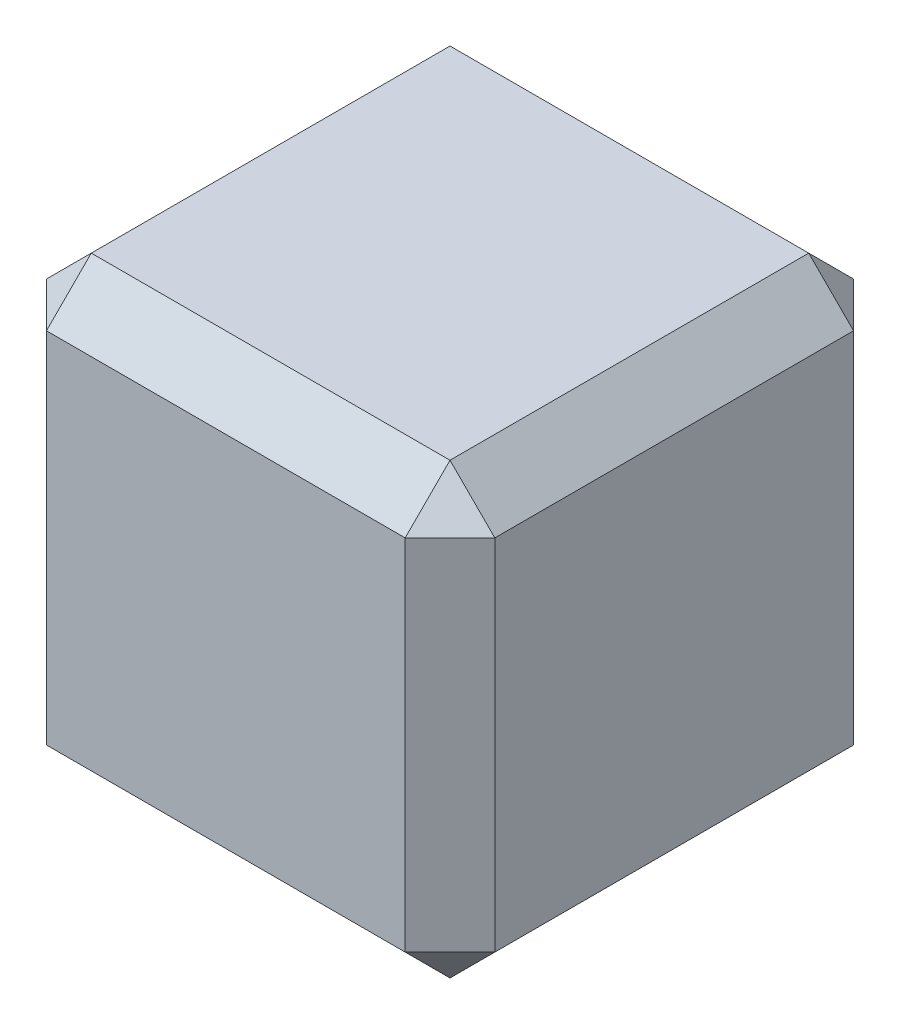
ISO-10303-21;
HEADER;
FILE_DESCRIPTION(('STEP AP214'),'2;1');
FILE_NAME('part.step','',(''),(''),'','','');
FILE_SCHEMA(('AUTOMOTIVE_DESIGN { 1 0 10303 214 1 1 1 1 }'));
ENDSEC;
DATA;
#1=APPLICATION_CONTEXT('core data for automotive mechanical design processes');
#2=APPLICATION_PROTOCOL_DEFINITION('international standard','automotive_design',2000,#1);
#3=PRODUCT_CONTEXT('',#1,'mechanical');
#4=PRODUCT('Part','Part','',(#3));
#5=PRODUCT_RELATED_PRODUCT_CATEGORY('part','',(#4));
#6=PRODUCT_DEFINITION_FORMATION('','',#4);
#7=PRODUCT_DEFINITION_CONTEXT('part definition',#1,'design');
#8=PRODUCT_DEFINITION('design','',#6,#7);
#9=PRODUCT_DEFINITION_SHAPE('','',#8);
#10=(LENGTH_UNIT() NAMED_UNIT(*) SI_UNIT(.MILLI.,.METRE.));
#11=(NAMED_UNIT(*) PLANE_ANGLE_UNIT() SI_UNIT($,.RADIAN.));
#12=(NAMED_UNIT(*) SI_UNIT($,.STERADIAN.) SOLID_ANGLE_UNIT());
#13=UNCERTAINTY_MEASURE_WITH_UNIT(LENGTH_MEASURE(1.E-05),#10,'distance_accuracy_value','');
#14=(GEOMETRIC_REPRESENTATION_CONTEXT(3) GLOBAL_UNCERTAINTY_ASSIGNED_CONTEXT((#13)) GLOBAL_UNIT_ASSIGNED_CONTEXT((#10,
#11,#12)) REPRESENTATION_CONTEXT('',''));
#15=CARTESIAN_POINT('',(0.,0.,0.));
#16=DIRECTION('',(0.,0.,1.));
#17=DIRECTION('',(1.,0.,0.));
#18=AXIS2_PLACEMENT_3D('',#15,#16,#17);
#19=CARTESIAN_POINT('',(5.,5.,5.));
#20=DIRECTION('',(-1.,0.,0.));
#21=DIRECTION('',(0.,0.,1.));
#22=AXIS2_PLACEMENT_3D('',#19,#20,#21);
#23=PLANE('',#22);
#24=DIRECTION('',(0.,0.,1.));
#25=VECTOR('',#24,1.);
#26=CARTESIAN_POINT('',(5.,4.,5.));
#27=LINE('',#26,#25);
#28=CARTESIAN_POINT('',(5.,4.,-4.));
#29=VERTEX_POINT('',#28);
#30=CARTESIAN_POINT('',(5.,4.,4.));
#31=VERTEX_POINT('',#30);
#32=EDGE_CURVE('E252',#29,#31,#27,.T.);
#33=ORIENTED_EDGE('',*,*,#32,.T.);
#34=DIRECTION('',(0.,-1.,0.));
#35=VECTOR('',#34,1.);
#36=CARTESIAN_POINT('',(5.,5.,4.));
#37=LINE('',#36,#35);
#38=CARTESIAN_POINT('',(5.,-4.,4.));
#39=VERTEX_POINT('',#38);
#40=EDGE_CURVE('E261',#31,#39,#37,.T.);
#41=ORIENTED_EDGE('',*,*,#40,.T.);
#42=DIRECTION('',(0.,0.,-1.));
#43=VECTOR('',#42,1.);
#44=CARTESIAN_POINT('',(5.,-4.,-5.));
#45=LINE('',#44,#43);
#46=CARTESIAN_POINT('',(5.,-4.,-4.));
#47=VERTEX_POINT('',#46);
#48=EDGE_CURVE('E258',#39,#47,#45,.T.);
#49=ORIENTED_EDGE('',*,*,#48,.T.);
#50=DIRECTION('',(0.,1.,0.));
#51=VECTOR('',#50,1.);
#52=CARTESIAN_POINT('',(5.,5.,-4.));
#53=LINE('',#52,#51);
#54=EDGE_CURVE('E255',#47,#29,#53,.T.);
#55=ORIENTED_EDGE('',*,*,#54,.T.);
#56=EDGE_LOOP('',(#33,#41,#49,#55));
#57=FACE_BOUND('',#56,.T.);
#58=ADVANCED_FACE('F49',(#57),#23,.F.);
#59=CARTESIAN_POINT('',(-5.,5.,-5.));
#60=DIRECTION('',(0.,0.,1.));
#61=DIRECTION('',(1.,0.,0.));
#62=AXIS2_PLACEMENT_3D('',#59,#60,#61);
#63=PLANE('',#62);
#64=DIRECTION('',(-1.,0.,0.));
#65=VECTOR('',#64,1.);
#66=CARTESIAN_POINT('',(-5.,-4.,-5.));
#67=LINE('',#66,#65);
#68=CARTESIAN_POINT('',(4.,-4.,-5.));
#69=VERTEX_POINT('',#68);
#70=CARTESIAN_POINT('',(-4.,-4.,-5.));
#71=VERTEX_POINT('',#70);
#72=EDGE_CURVE('E219',#69,#71,#67,.T.);
#73=ORIENTED_EDGE('',*,*,#72,.T.);
#74=DIRECTION('',(0.,1.,0.));
#75=VECTOR('',#74,1.);
#76=CARTESIAN_POINT('',(-4.,5.,-5.));
#77=LINE('',#76,#75);
#78=CARTESIAN_POINT('',(-4.,4.,-5.));
#79=VERTEX_POINT('',#78);
#80=EDGE_CURVE('E222',#71,#79,#77,.T.);
#81=ORIENTED_EDGE('',*,*,#80,.T.);
#82=DIRECTION('',(1.,0.,0.));
#83=VECTOR('',#82,1.);
#84=CARTESIAN_POINT('',(-5.,4.,-5.));
#85=LINE('',#84,#83);
#86=CARTESIAN_POINT('',(4.,4.,-5.));
#87=VERTEX_POINT('',#86);
#88=EDGE_CURVE('E213',#79,#87,#85,.T.);
#89=ORIENTED_EDGE('',*,*,#88,.T.);
#90=DIRECTION('',(0.,-1.,0.));
#91=VECTOR('',#90,1.);
#92=CARTESIAN_POINT('',(4.,5.,-5.));
#93=LINE('',#92,#91);
#94=EDGE_CURVE('E216',#87,#69,#93,.T.);
#95=ORIENTED_EDGE('',*,*,#94,.T.);
#96=EDGE_LOOP('',(#73,#81,#89,#95));
#97=FACE_BOUND('',#96,.T.);
#98=ADVANCED_FACE('F431',(#97),#63,.F.);
#99=CARTESIAN_POINT('',(-5.,5.,5.));
#100=DIRECTION('',(1.,0.,0.));
#101=DIRECTION('',(0.,0.,-1.));
#102=AXIS2_PLACEMENT_3D('',#99,#100,#101);
#103=PLANE('',#102);
#104=DIRECTION('',(0.,0.,-1.));
#105=VECTOR('',#104,1.);
#106=CARTESIAN_POINT('',(-5.,4.,5.));
#107=LINE('',#106,#105);
#108=CARTESIAN_POINT('',(-5.,4.,4.));
#109=VERTEX_POINT('',#108);
#110=CARTESIAN_POINT('',(-5.,4.,-4.));
#111=VERTEX_POINT('',#110);
#112=EDGE_CURVE('E199',#109,#111,#107,.T.);
#113=ORIENTED_EDGE('',*,*,#112,.T.);
#114=DIRECTION('',(0.,-1.,0.));
#115=VECTOR('',#114,1.);
#116=CARTESIAN_POINT('',(-5.,5.,-4.));
#117=LINE('',#116,#115);
#118=CARTESIAN_POINT('',(-5.,-4.,-4.));
#119=VERTEX_POINT('',#118);
#120=EDGE_CURVE('E209',#111,#119,#117,.T.);
#121=ORIENTED_EDGE('',*,*,#120,.T.);
#122=DIRECTION('',(0.,0.,1.));
#123=VECTOR('',#122,1.);
#124=CARTESIAN_POINT('',(-5.,-4.,5.));
#125=LINE('',#124,#123);
#126=CARTESIAN_POINT('',(-5.,-4.,4.));
#127=VERTEX_POINT('',#126);
#128=EDGE_CURVE('E206',#119,#127,#125,.T.);
#129=ORIENTED_EDGE('',*,*,#128,.T.);
#130=DIRECTION('',(0.,1.,0.));
#131=VECTOR('',#130,1.);
#132=CARTESIAN_POINT('',(-5.,5.,4.));
#133=LINE('',#132,#131);
#134=EDGE_CURVE('E202',#127,#109,#133,.T.);
#135=ORIENTED_EDGE('',*,*,#134,.T.);
#136=EDGE_LOOP('',(#113,#121,#129,#135));
#137=FACE_BOUND('',#136,.T.);
#138=ADVANCED_FACE('F460',(#137),#103,.F.);
#139=CARTESIAN_POINT('',(-5.,5.,5.));
#140=DIRECTION('',(0.,0.,-1.));
#141=DIRECTION('',(-1.,0.,0.));
#142=AXIS2_PLACEMENT_3D('',#139,#140,#141);
#143=PLANE('',#142);
#144=DIRECTION('',(-1.,0.,0.));
#145=VECTOR('',#144,1.);
#146=CARTESIAN_POINT('',(-5.,4.,5.));
#147=LINE('',#146,#145);
#148=CARTESIAN_POINT('',(4.,4.,5.));
#149=VERTEX_POINT('',#148);
#150=CARTESIAN_POINT('',(-4.,4.,5.));
#151=VERTEX_POINT('',#150);
#152=EDGE_CURVE('E239',#149,#151,#147,.T.);
#153=ORIENTED_EDGE('',*,*,#152,.T.);
#154=DIRECTION('',(0.,-1.,0.));
#155=VECTOR('',#154,1.);
#156=CARTESIAN_POINT('',(-4.,5.,5.));
#157=LINE('',#156,#155);
#158=CARTESIAN_POINT('',(-4.,-4.,5.));
#159=VERTEX_POINT('',#158);
#160=EDGE_CURVE('E248',#151,#159,#157,.T.);
#161=ORIENTED_EDGE('',*,*,#160,.T.);
#162=DIRECTION('',(1.,0.,0.));
#163=VECTOR('',#162,1.);
#164=CARTESIAN_POINT('',(5.,-4.,5.));
#165=LINE('',#164,#163);
#166=CARTESIAN_POINT('',(4.,-4.,5.));
#167=VERTEX_POINT('',#166);
#168=EDGE_CURVE('E245',#159,#167,#165,.T.);
#169=ORIENTED_EDGE('',*,*,#168,.T.);
#170=DIRECTION('',(0.,1.,0.));
#171=VECTOR('',#170,1.);
#172=CARTESIAN_POINT('',(4.,5.,5.));
#173=LINE('',#172,#171);
#174=EDGE_CURVE('E242',#167,#149,#173,.T.);
#175=ORIENTED_EDGE('',*,*,#174,.T.);
#176=EDGE_LOOP('',(#153,#161,#169,#175));
#177=FACE_BOUND('',#176,.T.);
#178=ADVANCED_FACE('F405',(#177),#143,.F.);
#179=CARTESIAN_POINT('',(0.,5.,0.));
#180=DIRECTION('',(0.,-1.,0.));
#181=DIRECTION('',(0.,0.,-1.));
#182=AXIS2_PLACEMENT_3D('',#179,#180,#181);
#183=PLANE('',#182);
#184=DIRECTION('',(0.,0.,1.));
#185=VECTOR('',#184,1.);
#186=CARTESIAN_POINT('',(-4.,5.,0.));
#187=LINE('',#186,#185);
#188=CARTESIAN_POINT('',(-4.,5.,-4.));
#189=VERTEX_POINT('',#188);
#190=CARTESIAN_POINT('',(-4.,5.,4.));
#191=VERTEX_POINT('',#190);
#192=EDGE_CURVE('E61',#189,#191,#187,.T.);
#193=ORIENTED_EDGE('',*,*,#192,.T.);
#194=DIRECTION('',(1.,0.,0.));
#195=VECTOR('',#194,1.);
#196=CARTESIAN_POINT('',(0.,5.,4.));
#197=LINE('',#196,#195);
#198=CARTESIAN_POINT('',(4.,5.,4.));
#199=VERTEX_POINT('',#198);
#200=EDGE_CURVE('E11',#191,#199,#197,.T.);
#201=ORIENTED_EDGE('',*,*,#200,.T.);
#202=DIRECTION('',(0.,0.,-1.));
#203=VECTOR('',#202,1.);
#204=CARTESIAN_POINT('',(4.,5.,0.));
#205=LINE('',#204,#203);
#206=CARTESIAN_POINT('',(4.,5.,-4.));
#207=VERTEX_POINT('',#206);
#208=EDGE_CURVE('E265',#199,#207,#205,.T.);
#209=ORIENTED_EDGE('',*,*,#208,.T.);
#210=DIRECTION('',(-1.,0.,0.));
#211=VECTOR('',#210,1.);
#212=CARTESIAN_POINT('',(0.,5.,-4.));
#213=LINE('',#212,#211);
#214=EDGE_CURVE('E72',#207,#189,#213,.T.);
#215=ORIENTED_EDGE('',*,*,#214,.T.);
#216=EDGE_LOOP('',(#193,#201,#209,#215));
#217=FACE_BOUND('',#216,.T.);
#218=ADVANCED_FACE('F571',(#217),#183,.F.);
#219=CARTESIAN_POINT('',(0.,-5.,0.));
#220=DIRECTION('',(0.,-1.,0.));
#221=DIRECTION('',(0.,0.,-1.));
#222=AXIS2_PLACEMENT_3D('',#219,#220,#221);
#223=PLANE('',#222);
#224=DIRECTION('',(0.,0.,-1.));
#225=VECTOR('',#224,1.);
#226=CARTESIAN_POINT('',(-4.,-5.,-5.));
#227=LINE('',#226,#225);
#228=CARTESIAN_POINT('',(-4.,-5.,4.));
#229=VERTEX_POINT('',#228);
#230=CARTESIAN_POINT('',(-4.,-5.,-4.));
#231=VERTEX_POINT('',#230);
#232=EDGE_CURVE('E232',#229,#231,#227,.T.);
#233=ORIENTED_EDGE('',*,*,#232,.T.);
#234=DIRECTION('',(1.,0.,0.));
#235=VECTOR('',#234,1.);
#236=CARTESIAN_POINT('',(5.,-5.,-4.));
#237=LINE('',#236,#235);
#238=CARTESIAN_POINT('',(4.,-5.,-4.));
#239=VERTEX_POINT('',#238);
#240=EDGE_CURVE('E235',#231,#239,#237,.T.);
#241=ORIENTED_EDGE('',*,*,#240,.T.);
#242=DIRECTION('',(0.,0.,1.));
#243=VECTOR('',#242,1.);
#244=CARTESIAN_POINT('',(4.,-5.,5.));
#245=LINE('',#244,#243);
#246=CARTESIAN_POINT('',(4.,-5.,4.));
#247=VERTEX_POINT('',#246);
#248=EDGE_CURVE('E226',#239,#247,#245,.T.);
#249=ORIENTED_EDGE('',*,*,#248,.T.);
#250=DIRECTION('',(-1.,0.,0.));
#251=VECTOR('',#250,1.);
#252=CARTESIAN_POINT('',(-5.,-5.,4.));
#253=LINE('',#252,#251);
#254=EDGE_CURVE('E229',#247,#229,#253,.T.);
#255=ORIENTED_EDGE('',*,*,#254,.T.);
#256=EDGE_LOOP('',(#233,#241,#249,#255));
#257=FACE_BOUND('',#256,.T.);
#258=ADVANCED_FACE('F372',(#257),#223,.T.);
#259=CARTESIAN_POINT('',(5.,5.,4.));
#260=DIRECTION('',(-0.707106781186548,0.,-0.707106781186547));
#261=DIRECTION('',(0.,-1.,0.));
#262=AXIS2_PLACEMENT_3D('',#259,#260,#261);
#263=PLANE('',#262);
#264=DIRECTION('',(-0.707106781186547,0.,0.707106781186548));
#265=VECTOR('',#264,1.);
#266=CARTESIAN_POINT('',(4.,4.,5.));
#267=LINE('',#266,#265);
#268=EDGE_CURVE('E54',#149,#31,#267,.F.);
#269=ORIENTED_EDGE('',*,*,#268,.F.);
#270=ORIENTED_EDGE('',*,*,#174,.F.);
#271=DIRECTION('',(0.707106781186547,0.,-0.707106781186548));
#272=VECTOR('',#271,1.);
#273=CARTESIAN_POINT('',(4.,-4.,5.));
#274=LINE('',#273,#272);
#275=EDGE_CURVE('E197',#39,#167,#274,.F.);
#276=ORIENTED_EDGE('',*,*,#275,.F.);
#277=ORIENTED_EDGE('',*,*,#40,.F.);
#278=EDGE_LOOP('',(#269,#270,#276,#277));
#279=FACE_BOUND('',#278,.T.);
#280=ADVANCED_FACE('F52',(#279),#263,.F.);
#281=CARTESIAN_POINT('',(4.,4.,5.));
#282=DIRECTION('',(0.577350269189627,0.577350269189625,0.577350269189626));
#283=DIRECTION('',(0.707106781186547,0.,-0.707106781186548));
#284=AXIS2_PLACEMENT_3D('',#281,#282,#283);
#285=PLANE('',#284);
#286=DIRECTION('',(0.,0.707106781186548,-0.707106781186547));
#287=VECTOR('',#286,1.);
#288=CARTESIAN_POINT('',(4.,4.,5.));
#289=LINE('',#288,#287);
#290=EDGE_CURVE('E348',#149,#199,#289,.T.);
#291=ORIENTED_EDGE('',*,*,#290,.F.);
#292=ORIENTED_EDGE('',*,*,#268,.T.);
#293=DIRECTION('',(0.707106781186547,-0.707106781186548,0.));
#294=VECTOR('',#293,1.);
#295=CARTESIAN_POINT('',(4.5,4.5,4.));
#296=LINE('',#295,#294);
#297=EDGE_CURVE('E352',#199,#31,#296,.T.);
#298=ORIENTED_EDGE('',*,*,#297,.F.);
#299=EDGE_LOOP('',(#291,#292,#298));
#300=FACE_BOUND('',#299,.T.);
#301=ADVANCED_FACE('F398',(#300),#285,.T.);
#302=CARTESIAN_POINT('',(4.,-4.,5.));
#303=DIRECTION('',(0.577350269189627,-0.577350269189626,0.577350269189625));
#304=DIRECTION('',(0.707106781186547,0.707106781186548,0.));
#305=AXIS2_PLACEMENT_3D('',#302,#303,#304);
#306=PLANE('',#305);
#307=DIRECTION('',(0.707106781186547,0.707106781186548,0.));
#308=VECTOR('',#307,1.);
#309=CARTESIAN_POINT('',(4.5,-4.5,4.));
#310=LINE('',#309,#308);
#311=EDGE_CURVE('E340',#39,#247,#310,.F.);
#312=ORIENTED_EDGE('',*,*,#311,.F.);
#313=ORIENTED_EDGE('',*,*,#275,.T.);
#314=DIRECTION('',(0.,-0.707106781186547,-0.707106781186548));
#315=VECTOR('',#314,1.);
#316=CARTESIAN_POINT('',(4.,-4.,5.));
#317=LINE('',#316,#315);
#318=EDGE_CURVE('E344',#247,#167,#317,.F.);
#319=ORIENTED_EDGE('',*,*,#318,.F.);
#320=EDGE_LOOP('',(#312,#313,#319));
#321=FACE_BOUND('',#320,.T.);
#322=ADVANCED_FACE('F361',(#321),#306,.T.);
#323=CARTESIAN_POINT('',(4.,5.,0.));
#324=DIRECTION('',(-0.707106781186548,-0.707106781186547,0.));
#325=DIRECTION('',(0.,0.,-1.));
#326=AXIS2_PLACEMENT_3D('',#323,#324,#325);
#327=PLANE('',#326);
#328=ORIENTED_EDGE('',*,*,#297,.T.);
#329=ORIENTED_EDGE('',*,*,#32,.F.);
#330=DIRECTION('',(-0.707106781186547,0.707106781186548,0.));
#331=VECTOR('',#330,1.);
#332=CARTESIAN_POINT('',(5.,4.,-4.));
#333=LINE('',#332,#331);
#334=EDGE_CURVE('E332',#207,#29,#333,.F.);
#335=ORIENTED_EDGE('',*,*,#334,.F.);
#336=ORIENTED_EDGE('',*,*,#208,.F.);
#337=EDGE_LOOP('',(#328,#329,#335,#336));
#338=FACE_BOUND('',#337,.T.);
#339=ADVANCED_FACE('F393',(#338),#327,.F.);
#340=CARTESIAN_POINT('',(0.,5.,4.));
#341=DIRECTION('',(0.,-0.707106781186547,-0.707106781186548));
#342=DIRECTION('',(1.,0.,0.));
#343=AXIS2_PLACEMENT_3D('',#340,#341,#342);
#344=PLANE('',#343);
#345=ORIENTED_EDGE('',*,*,#290,.T.);
#346=ORIENTED_EDGE('',*,*,#200,.F.);
#347=DIRECTION('',(0.,-0.707106781186548,0.707106781186547));
#348=VECTOR('',#347,1.);
#349=CARTESIAN_POINT('',(-4.,4.5,4.5));
#350=LINE('',#349,#348);
#351=EDGE_CURVE('E328',#151,#191,#350,.F.);
#352=ORIENTED_EDGE('',*,*,#351,.F.);
#353=ORIENTED_EDGE('',*,*,#152,.F.);
#354=EDGE_LOOP('',(#345,#346,#352,#353));
#355=FACE_BOUND('',#354,.T.);
#356=ADVANCED_FACE('F402',(#355),#344,.F.);
#357=CARTESIAN_POINT('',(-4.,5.,5.));
#358=DIRECTION('',(0.707106781186548,0.,-0.707106781186547));
#359=DIRECTION('',(0.,-1.,0.));
#360=AXIS2_PLACEMENT_3D('',#357,#358,#359);
#361=PLANE('',#360);
#362=DIRECTION('',(0.707106781186547,0.,0.707106781186548));
#363=VECTOR('',#362,1.);
#364=CARTESIAN_POINT('',(-5.,-4.,4.));
#365=LINE('',#364,#363);
#366=EDGE_CURVE('E320',#159,#127,#365,.F.);
#367=ORIENTED_EDGE('',*,*,#366,.F.);
#368=ORIENTED_EDGE('',*,*,#160,.F.);
#369=DIRECTION('',(-0.707106781186547,0.,-0.707106781186548));
#370=VECTOR('',#369,1.);
#371=CARTESIAN_POINT('',(-5.,4.,4.));
#372=LINE('',#371,#370);
#373=EDGE_CURVE('E324',#109,#151,#372,.F.);
#374=ORIENTED_EDGE('',*,*,#373,.F.);
#375=ORIENTED_EDGE('',*,*,#134,.F.);
#376=EDGE_LOOP('',(#367,#368,#374,#375));
#377=FACE_BOUND('',#376,.T.);
#378=ADVANCED_FACE('F409',(#377),#361,.F.);
#379=CARTESIAN_POINT('',(-5.,-4.,5.));
#380=DIRECTION('',(0.,-0.707106781186548,0.707106781186547));
#381=DIRECTION('',(-1.,0.,0.));
#382=AXIS2_PLACEMENT_3D('',#379,#380,#381);
#383=PLANE('',#382);
#384=ORIENTED_EDGE('',*,*,#318,.T.);
#385=ORIENTED_EDGE('',*,*,#168,.F.);
#386=DIRECTION('',(0.,0.707106781186547,0.707106781186548));
#387=VECTOR('',#386,1.);
#388=CARTESIAN_POINT('',(-4.,-4.5,4.5));
#389=LINE('',#388,#387);
#390=EDGE_CURVE('E317',#229,#159,#389,.T.);
#391=ORIENTED_EDGE('',*,*,#390,.F.);
#392=ORIENTED_EDGE('',*,*,#254,.F.);
#393=EDGE_LOOP('',(#384,#385,#391,#392));
#394=FACE_BOUND('',#393,.T.);
#395=ADVANCED_FACE('F368',(#394),#383,.T.);
#396=CARTESIAN_POINT('',(5.,-4.,5.));
#397=DIRECTION('',(0.707106781186548,-0.707106781186547,0.));
#398=DIRECTION('',(0.,0.,1.));
#399=AXIS2_PLACEMENT_3D('',#396,#397,#398);
#400=PLANE('',#399);
#401=ORIENTED_EDGE('',*,*,#311,.T.);
#402=ORIENTED_EDGE('',*,*,#248,.F.);
#403=DIRECTION('',(-0.707106781186547,-0.707106781186548,0.));
#404=VECTOR('',#403,1.);
#405=CARTESIAN_POINT('',(4.,-5.,-4.));
#406=LINE('',#405,#404);
#407=EDGE_CURVE('E313',#47,#239,#406,.T.);
#408=ORIENTED_EDGE('',*,*,#407,.F.);
#409=ORIENTED_EDGE('',*,*,#48,.F.);
#410=EDGE_LOOP('',(#401,#402,#408,#409));
#411=FACE_BOUND('',#410,.T.);
#412=ADVANCED_FACE('F378',(#411),#400,.T.);
#413=CARTESIAN_POINT('',(4.,5.,-5.));
#414=DIRECTION('',(-0.707106781186548,0.,0.707106781186547));
#415=DIRECTION('',(0.,-1.,0.));
#416=AXIS2_PLACEMENT_3D('',#413,#414,#415);
#417=PLANE('',#416);
#418=DIRECTION('',(0.707106781186547,0.,0.707106781186548));
#419=VECTOR('',#418,1.);
#420=CARTESIAN_POINT('',(5.,4.,-4.));
#421=LINE('',#420,#419);
#422=EDGE_CURVE('E336',#29,#87,#421,.F.);
#423=ORIENTED_EDGE('',*,*,#422,.F.);
#424=ORIENTED_EDGE('',*,*,#54,.F.);
#425=DIRECTION('',(-0.707106781186547,0.,-0.707106781186548));
#426=VECTOR('',#425,1.);
#427=CARTESIAN_POINT('',(4.5,-4.,-4.5));
#428=LINE('',#427,#426);
#429=EDGE_CURVE('E309',#69,#47,#428,.F.);
#430=ORIENTED_EDGE('',*,*,#429,.F.);
#431=ORIENTED_EDGE('',*,*,#94,.F.);
#432=EDGE_LOOP('',(#423,#424,#430,#431));
#433=FACE_BOUND('',#432,.T.);
#434=ADVANCED_FACE('F385',(#433),#417,.F.);
#435=CARTESIAN_POINT('',(5.,4.,-4.));
#436=DIRECTION('',(0.577350269189627,0.577350269189625,-0.577350269189626));
#437=DIRECTION('',(-0.707106781186547,0.,-0.707106781186548));
#438=AXIS2_PLACEMENT_3D('',#435,#436,#437);
#439=PLANE('',#438);
#440=ORIENTED_EDGE('',*,*,#334,.T.);
#441=ORIENTED_EDGE('',*,*,#422,.T.);
#442=DIRECTION('',(0.,-0.707106781186548,-0.707106781186547));
#443=VECTOR('',#442,1.);
#444=CARTESIAN_POINT('',(4.,4.5,-4.5));
#445=LINE('',#444,#443);
#446=EDGE_CURVE('E305',#207,#87,#445,.T.);
#447=ORIENTED_EDGE('',*,*,#446,.F.);
#448=EDGE_LOOP('',(#440,#441,#447));
#449=FACE_BOUND('',#448,.T.);
#450=ADVANCED_FACE('F391',(#449),#439,.T.);
#451=CARTESIAN_POINT('',(-5.,4.,4.));
#452=DIRECTION('',(-0.577350269189627,0.577350269189625,0.577350269189626));
#453=DIRECTION('',(0.707106781186547,0.,0.707106781186548));
#454=AXIS2_PLACEMENT_3D('',#451,#452,#453);
#455=PLANE('',#454);
#456=ORIENTED_EDGE('',*,*,#373,.T.);
#457=ORIENTED_EDGE('',*,*,#351,.T.);
#458=DIRECTION('',(0.707106781186547,0.707106781186548,0.));
#459=VECTOR('',#458,1.);
#460=CARTESIAN_POINT('',(-5.,4.,4.));
#461=LINE('',#460,#459);
#462=EDGE_CURVE('E301',#109,#191,#461,.T.);
#463=ORIENTED_EDGE('',*,*,#462,.F.);
#464=EDGE_LOOP('',(#456,#457,#463));
#465=FACE_BOUND('',#464,.T.);
#466=ADVANCED_FACE('F443',(#465),#455,.T.);
#467=CARTESIAN_POINT('',(-5.,-4.,4.));
#468=DIRECTION('',(-0.577350269189626,-0.577350269189627,0.577350269189625));
#469=DIRECTION('',(0.707106781186548,-0.707106781186547,0.));
#470=AXIS2_PLACEMENT_3D('',#467,#468,#469);
#471=PLANE('',#470);
#472=ORIENTED_EDGE('',*,*,#390,.T.);
#473=ORIENTED_EDGE('',*,*,#366,.T.);
#474=DIRECTION('',(0.707106781186548,-0.707106781186547,0.));
#475=VECTOR('',#474,1.);
#476=CARTESIAN_POINT('',(-5.,-4.,4.));
#477=LINE('',#476,#475);
#478=EDGE_CURVE('E297',#229,#127,#477,.F.);
#479=ORIENTED_EDGE('',*,*,#478,.F.);
#480=EDGE_LOOP('',(#472,#473,#479));
#481=FACE_BOUND('',#480,.T.);
#482=ADVANCED_FACE('F413',(#481),#471,.T.);
#483=CARTESIAN_POINT('',(4.,-5.,-4.));
#484=DIRECTION('',(0.577350269189627,-0.577350269189626,-0.577350269189625));
#485=DIRECTION('',(0.707106781186547,0.707106781186548,0.));
#486=AXIS2_PLACEMENT_3D('',#483,#484,#485);
#487=PLANE('',#486);
#488=ORIENTED_EDGE('',*,*,#429,.T.);
#489=ORIENTED_EDGE('',*,*,#407,.T.);
#490=DIRECTION('',(0.,0.707106781186547,-0.707106781186548));
#491=VECTOR('',#490,1.);
#492=CARTESIAN_POINT('',(4.,-5.,-4.));
#493=LINE('',#492,#491);
#494=EDGE_CURVE('E294',#69,#239,#493,.F.);
#495=ORIENTED_EDGE('',*,*,#494,.F.);
#496=EDGE_LOOP('',(#488,#489,#495));
#497=FACE_BOUND('',#496,.T.);
#498=ADVANCED_FACE('F450',(#497),#487,.T.);
#499=CARTESIAN_POINT('',(0.,5.,-4.));
#500=DIRECTION('',(0.,-0.707106781186547,0.707106781186548));
#501=DIRECTION('',(-1.,0.,0.));
#502=AXIS2_PLACEMENT_3D('',#499,#500,#501);
#503=PLANE('',#502);
#504=ORIENTED_EDGE('',*,*,#446,.T.);
#505=ORIENTED_EDGE('',*,*,#88,.F.);
#506=DIRECTION('',(0.,0.707106781186548,0.707106781186547));
#507=VECTOR('',#506,1.);
#508=CARTESIAN_POINT('',(-4.,4.,-5.));
#509=LINE('',#508,#507);
#510=EDGE_CURVE('E290',#189,#79,#509,.F.);
#511=ORIENTED_EDGE('',*,*,#510,.F.);
#512=ORIENTED_EDGE('',*,*,#214,.F.);
#513=EDGE_LOOP('',(#504,#505,#511,#512));
#514=FACE_BOUND('',#513,.T.);
#515=ADVANCED_FACE('F435',(#514),#503,.F.);
#516=CARTESIAN_POINT('',(-4.,5.,0.));
#517=DIRECTION('',(0.707106781186548,-0.707106781186547,0.));
#518=DIRECTION('',(0.,0.,1.));
#519=AXIS2_PLACEMENT_3D('',#516,#517,#518);
#520=PLANE('',#519);
#521=ORIENTED_EDGE('',*,*,#462,.T.);
#522=ORIENTED_EDGE('',*,*,#192,.F.);
#523=DIRECTION('',(-0.707106781186547,-0.707106781186548,0.));
#524=VECTOR('',#523,1.);
#525=CARTESIAN_POINT('',(-4.5,4.5,-4.));
#526=LINE('',#525,#524);
#527=EDGE_CURVE('E286',#111,#189,#526,.F.);
#528=ORIENTED_EDGE('',*,*,#527,.F.);
#529=ORIENTED_EDGE('',*,*,#112,.F.);
#530=EDGE_LOOP('',(#521,#522,#528,#529));
#531=FACE_BOUND('',#530,.T.);
#532=ADVANCED_FACE('F441',(#531),#520,.F.);
#533=CARTESIAN_POINT('',(-5.,-4.,5.));
#534=DIRECTION('',(-0.707106781186547,-0.707106781186548,0.));
#535=DIRECTION('',(0.,0.,-1.));
#536=AXIS2_PLACEMENT_3D('',#533,#534,#535);
#537=PLANE('',#536);
#538=ORIENTED_EDGE('',*,*,#478,.T.);
#539=ORIENTED_EDGE('',*,*,#128,.F.);
#540=DIRECTION('',(-0.707106781186548,0.707106781186547,0.));
#541=VECTOR('',#540,1.);
#542=CARTESIAN_POINT('',(-5.,-4.,-4.));
#543=LINE('',#542,#541);
#544=EDGE_CURVE('E282',#231,#119,#543,.T.);
#545=ORIENTED_EDGE('',*,*,#544,.F.);
#546=ORIENTED_EDGE('',*,*,#232,.F.);
#547=EDGE_LOOP('',(#538,#539,#545,#546));
#548=FACE_BOUND('',#547,.T.);
#549=ADVANCED_FACE('F416',(#548),#537,.T.);
#550=CARTESIAN_POINT('',(-5.,-4.,-5.));
#551=DIRECTION('',(0.,-0.707106781186548,-0.707106781186547));
#552=DIRECTION('',(1.,0.,0.));
#553=AXIS2_PLACEMENT_3D('',#550,#551,#552);
#554=PLANE('',#553);
#555=ORIENTED_EDGE('',*,*,#494,.T.);
#556=ORIENTED_EDGE('',*,*,#240,.F.);
#557=DIRECTION('',(0.,-0.707106781186547,0.707106781186548));
#558=VECTOR('',#557,1.);
#559=CARTESIAN_POINT('',(-4.,-4.5,-4.5));
#560=LINE('',#559,#558);
#561=EDGE_CURVE('E278',#71,#231,#560,.T.);
#562=ORIENTED_EDGE('',*,*,#561,.F.);
#563=ORIENTED_EDGE('',*,*,#72,.F.);
#564=EDGE_LOOP('',(#555,#556,#562,#563));
#565=FACE_BOUND('',#564,.T.);
#566=ADVANCED_FACE('F425',(#565),#554,.T.);
#567=CARTESIAN_POINT('',(-4.,4.,-5.));
#568=DIRECTION('',(-0.577350269189626,0.577350269189625,-0.577350269189627));
#569=DIRECTION('',(-0.707106781186548,0.,0.707106781186547));
#570=AXIS2_PLACEMENT_3D('',#567,#568,#569);
#571=PLANE('',#570);
#572=ORIENTED_EDGE('',*,*,#527,.T.);
#573=ORIENTED_EDGE('',*,*,#510,.T.);
#574=DIRECTION('',(0.707106781186548,0.,-0.707106781186547));
#575=VECTOR('',#574,1.);
#576=CARTESIAN_POINT('',(-4.,4.,-5.));
#577=LINE('',#576,#575);
#578=EDGE_CURVE('E275',#111,#79,#577,.T.);
#579=ORIENTED_EDGE('',*,*,#578,.F.);
#580=EDGE_LOOP('',(#572,#573,#579));
#581=FACE_BOUND('',#580,.T.);
#582=ADVANCED_FACE('F438',(#581),#571,.T.);
#583=CARTESIAN_POINT('',(-5.,-4.,-4.));
#584=DIRECTION('',(-0.577350269189625,-0.577350269189627,-0.577350269189626));
#585=DIRECTION('',(0.,0.707106781186547,-0.707106781186548));
#586=AXIS2_PLACEMENT_3D('',#583,#584,#585);
#587=PLANE('',#586);
#588=ORIENTED_EDGE('',*,*,#561,.T.);
#589=ORIENTED_EDGE('',*,*,#544,.T.);
#590=DIRECTION('',(-0.707106781186548,0.,0.707106781186547));
#591=VECTOR('',#590,1.);
#592=CARTESIAN_POINT('',(-5.,-4.,-4.));
#593=LINE('',#592,#591);
#594=EDGE_CURVE('E272',#71,#119,#593,.T.);
#595=ORIENTED_EDGE('',*,*,#594,.F.);
#596=EDGE_LOOP('',(#588,#589,#595));
#597=FACE_BOUND('',#596,.T.);
#598=ADVANCED_FACE('F421',(#597),#587,.T.);
#599=CARTESIAN_POINT('',(-5.,5.,-4.));
#600=DIRECTION('',(0.707106781186547,0.,0.707106781186548));
#601=DIRECTION('',(0.,-1.,0.));
#602=AXIS2_PLACEMENT_3D('',#599,#600,#601);
#603=PLANE('',#602);
#604=ORIENTED_EDGE('',*,*,#578,.T.);
#605=ORIENTED_EDGE('',*,*,#80,.F.);
#606=ORIENTED_EDGE('',*,*,#594,.T.);
#607=ORIENTED_EDGE('',*,*,#120,.F.);
#608=EDGE_LOOP('',(#604,#605,#606,#607));
#609=FACE_BOUND('',#608,.T.);
#610=ADVANCED_FACE('F427',(#609),#603,.F.);
#611=CLOSED_SHELL('',(#58,#98,#138,#178,#218,#258,#280,#301,#322,#339,#356,#378,#395,#412,#434,
#450,#466,#482,#498,#515,#532,#549,#566,#582,#598,#610));
#612=CARTESIAN_POINT('',(4.,5.,5.));
#613=DIRECTION('',(-1.,0.,0.));
#614=DIRECTION('',(0.,0.,1.));
#615=AXIS2_PLACEMENT_3D('',#612,#613,#614);
#616=PLANE('',#615);
#617=DIRECTION('',(0.,0.,-1.));
#618=VECTOR('',#617,1.);
#619=CARTESIAN_POINT('',(4.,-4.,0.));
#620=LINE('',#619,#618);
#621=CARTESIAN_POINT('',(4.,-4.,4.));
#622=VERTEX_POINT('',#621);
#623=CARTESIAN_POINT('',(4.,-4.,-4.));
#624=VERTEX_POINT('',#623);
#625=EDGE_CURVE('E181',#622,#624,#620,.T.);
#626=ORIENTED_EDGE('',*,*,#625,.F.);
#627=DIRECTION('',(0.,-1.,0.));
#628=VECTOR('',#627,1.);
#629=CARTESIAN_POINT('',(4.,5.,4.));
#630=LINE('',#629,#628);
#631=CARTESIAN_POINT('',(4.,4.,4.));
#632=VERTEX_POINT('',#631);
#633=EDGE_CURVE('E174',#632,#622,#630,.T.);
#634=ORIENTED_EDGE('',*,*,#633,.F.);
#635=DIRECTION('',(0.,0.,-1.));
#636=VECTOR('',#635,1.);
#637=CARTESIAN_POINT('',(4.,4.,0.));
#638=LINE('',#637,#636);
#639=CARTESIAN_POINT('',(4.,4.,-4.));
#640=VERTEX_POINT('',#639);
#641=EDGE_CURVE('E183',#632,#640,#638,.T.);
#642=ORIENTED_EDGE('',*,*,#641,.T.);
#643=DIRECTION('',(0.,-1.,0.));
#644=VECTOR('',#643,1.);
#645=CARTESIAN_POINT('',(4.,5.,-4.));
#646=LINE('',#645,#644);
#647=EDGE_CURVE('E167',#640,#624,#646,.T.);
#648=ORIENTED_EDGE('',*,*,#647,.T.);
#649=EDGE_LOOP('',(#626,#634,#642,#648));
#650=FACE_BOUND('',#649,.T.);
#651=ADVANCED_FACE('F179',(#650),#616,.T.);
#652=CARTESIAN_POINT('',(-5.,5.,-4.));
#653=DIRECTION('',(0.,0.,1.));
#654=DIRECTION('',(1.,0.,0.));
#655=AXIS2_PLACEMENT_3D('',#652,#653,#654);
#656=PLANE('',#655);
#657=DIRECTION('',(-1.,0.,0.));
#658=VECTOR('',#657,1.);
#659=CARTESIAN_POINT('',(0.,-4.,-4.));
#660=LINE('',#659,#658);
#661=CARTESIAN_POINT('',(-4.,-4.,-4.));
#662=VERTEX_POINT('',#661);
#663=EDGE_CURVE('E164',#624,#662,#660,.T.);
#664=ORIENTED_EDGE('',*,*,#663,.F.);
#665=ORIENTED_EDGE('',*,*,#647,.F.);
#666=DIRECTION('',(-1.,0.,0.));
#667=VECTOR('',#666,1.);
#668=CARTESIAN_POINT('',(0.,4.,-4.));
#669=LINE('',#668,#667);
#670=CARTESIAN_POINT('',(-4.,4.,-4.));
#671=VERTEX_POINT('',#670);
#672=EDGE_CURVE('E807',#640,#671,#669,.T.);
#673=ORIENTED_EDGE('',*,*,#672,.T.);
#674=DIRECTION('',(0.,-1.,0.));
#675=VECTOR('',#674,1.);
#676=CARTESIAN_POINT('',(-4.,5.,-4.));
#677=LINE('',#676,#675);
#678=EDGE_CURVE('E169',#671,#662,#677,.T.);
#679=ORIENTED_EDGE('',*,*,#678,.T.);
#680=EDGE_LOOP('',(#664,#665,#673,#679));
#681=FACE_BOUND('',#680,.T.);
#682=ADVANCED_FACE('F166',(#681),#656,.T.);
#683=CARTESIAN_POINT('',(-4.,5.,5.));
#684=DIRECTION('',(1.,0.,0.));
#685=DIRECTION('',(0.,0.,-1.));
#686=AXIS2_PLACEMENT_3D('',#683,#684,#685);
#687=PLANE('',#686);
#688=DIRECTION('',(0.,0.,1.));
#689=VECTOR('',#688,1.);
#690=CARTESIAN_POINT('',(-4.,-4.,0.));
#691=LINE('',#690,#689);
#692=CARTESIAN_POINT('',(-4.,-4.,4.));
#693=VERTEX_POINT('',#692);
#694=EDGE_CURVE('E185',#662,#693,#691,.T.);
#695=ORIENTED_EDGE('',*,*,#694,.F.);
#696=ORIENTED_EDGE('',*,*,#678,.F.);
#697=DIRECTION('',(0.,0.,1.));
#698=VECTOR('',#697,1.);
#699=CARTESIAN_POINT('',(-4.,4.,0.));
#700=LINE('',#699,#698);
#701=CARTESIAN_POINT('',(-4.,4.,4.));
#702=VERTEX_POINT('',#701);
#703=EDGE_CURVE('E813',#671,#702,#700,.T.);
#704=ORIENTED_EDGE('',*,*,#703,.T.);
#705=DIRECTION('',(0.,-1.,0.));
#706=VECTOR('',#705,1.);
#707=CARTESIAN_POINT('',(-4.,5.,4.));
#708=LINE('',#707,#706);
#709=EDGE_CURVE('E809',#702,#693,#708,.T.);
#710=ORIENTED_EDGE('',*,*,#709,.T.);
#711=EDGE_LOOP('',(#695,#696,#704,#710));
#712=FACE_BOUND('',#711,.T.);
#713=ADVANCED_FACE('F468',(#712),#687,.T.);
#714=CARTESIAN_POINT('',(-5.,5.,4.));
#715=DIRECTION('',(0.,0.,-1.));
#716=DIRECTION('',(-1.,0.,0.));
#717=AXIS2_PLACEMENT_3D('',#714,#715,#716);
#718=PLANE('',#717);
#719=DIRECTION('',(1.,0.,0.));
#720=VECTOR('',#719,1.);
#721=CARTESIAN_POINT('',(0.,-4.,4.));
#722=LINE('',#721,#720);
#723=EDGE_CURVE('E189',#693,#622,#722,.T.);
#724=ORIENTED_EDGE('',*,*,#723,.F.);
#725=ORIENTED_EDGE('',*,*,#709,.F.);
#726=DIRECTION('',(1.,0.,0.));
#727=VECTOR('',#726,1.);
#728=CARTESIAN_POINT('',(0.,4.,4.));
#729=LINE('',#728,#727);
#730=EDGE_CURVE('E203',#702,#632,#729,.T.);
#731=ORIENTED_EDGE('',*,*,#730,.T.);
#732=ORIENTED_EDGE('',*,*,#633,.T.);
#733=EDGE_LOOP('',(#724,#725,#731,#732));
#734=FACE_BOUND('',#733,.T.);
#735=ADVANCED_FACE('F471',(#734),#718,.T.);
#736=CARTESIAN_POINT('',(0.,4.,0.));
#737=DIRECTION('',(0.,-1.,0.));
#738=DIRECTION('',(0.,0.,-1.));
#739=AXIS2_PLACEMENT_3D('',#736,#737,#738);
#740=PLANE('',#739);
#741=ORIENTED_EDGE('',*,*,#641,.F.);
#742=ORIENTED_EDGE('',*,*,#730,.F.);
#743=ORIENTED_EDGE('',*,*,#703,.F.);
#744=ORIENTED_EDGE('',*,*,#672,.F.);
#745=EDGE_LOOP('',(#741,#742,#743,#744));
#746=FACE_BOUND('',#745,.T.);
#747=ADVANCED_FACE('F475',(#746),#740,.T.);
#748=CARTESIAN_POINT('',(0.,-4.,0.));
#749=DIRECTION('',(0.,-1.,0.));
#750=DIRECTION('',(0.,0.,-1.));
#751=AXIS2_PLACEMENT_3D('',#748,#749,#750);
#752=PLANE('',#751);
#753=ORIENTED_EDGE('',*,*,#625,.T.);
#754=ORIENTED_EDGE('',*,*,#663,.T.);
#755=ORIENTED_EDGE('',*,*,#694,.T.);
#756=ORIENTED_EDGE('',*,*,#723,.T.);
#757=EDGE_LOOP('',(#753,#754,#755,#756));
#758=FACE_BOUND('',#757,.T.);
#759=ADVANCED_FACE('F187',(#758),#752,.F.);
#760=CLOSED_SHELL('',(#651,#682,#713,#735,#747,#759));
#761=ORIENTED_CLOSED_SHELL('',*,#760,.T.);
#762=BREP_WITH_VOIDS('B2',#611,(#761));
#763=ADVANCED_BREP_SHAPE_REPRESENTATION('',(#18,#762),#14);
#764=SHAPE_DEFINITION_REPRESENTATION(#9,#763);
ENDSEC;
END-ISO-10303-21;
